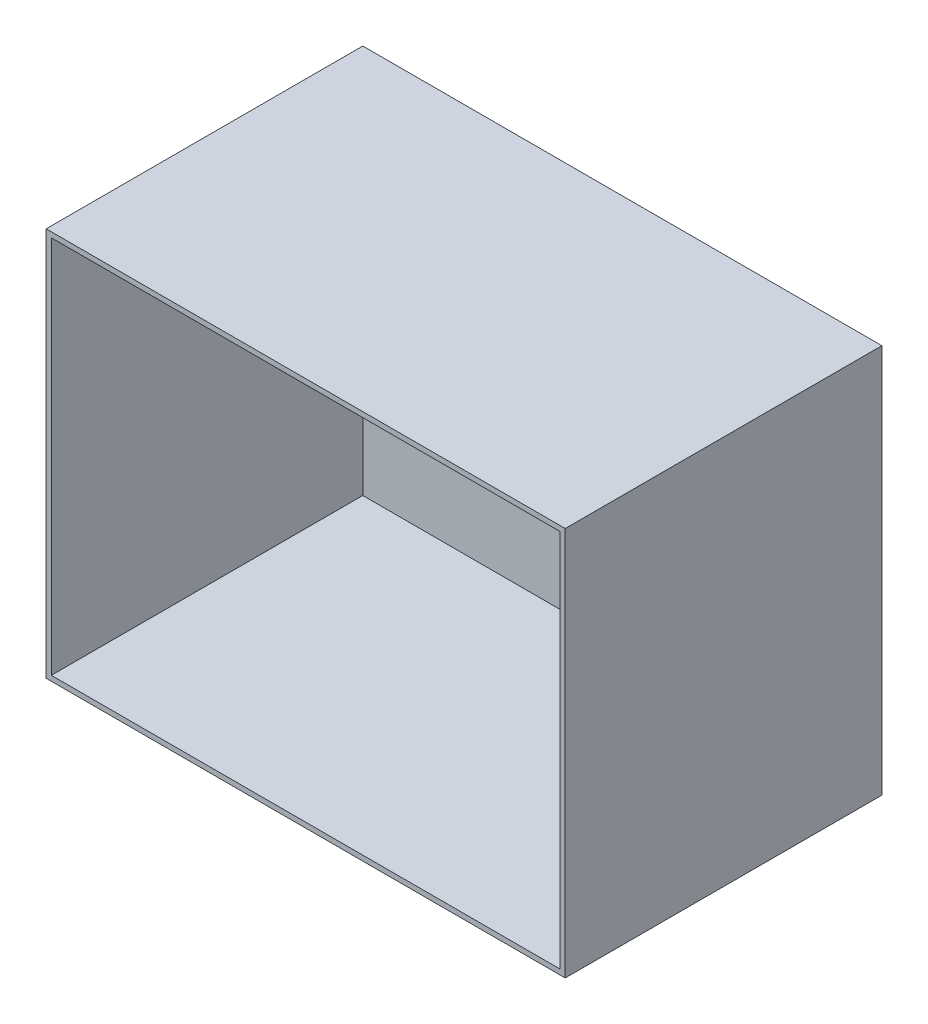
ISO-10303-21;
HEADER;
FILE_DESCRIPTION(('STEP AP214'),'2;1');
FILE_NAME('part.step','',(''),(''),'','','');
FILE_SCHEMA(('AUTOMOTIVE_DESIGN { 1 0 10303 214 1 1 1 1 }'));
ENDSEC;
DATA;
#1=APPLICATION_CONTEXT('core data for automotive mechanical design processes');
#2=APPLICATION_PROTOCOL_DEFINITION('international standard','automotive_design',2000,#1);
#3=PRODUCT_CONTEXT('',#1,'mechanical');
#4=PRODUCT('Part','Part','',(#3));
#5=PRODUCT_RELATED_PRODUCT_CATEGORY('part','',(#4));
#6=PRODUCT_DEFINITION_FORMATION('','',#4);
#7=PRODUCT_DEFINITION_CONTEXT('part definition',#1,'design');
#8=PRODUCT_DEFINITION('design','',#6,#7);
#9=PRODUCT_DEFINITION_SHAPE('','',#8);
#10=(LENGTH_UNIT() NAMED_UNIT(*) SI_UNIT(.MILLI.,.METRE.));
#11=(NAMED_UNIT(*) PLANE_ANGLE_UNIT() SI_UNIT($,.RADIAN.));
#12=(NAMED_UNIT(*) SI_UNIT($,.STERADIAN.) SOLID_ANGLE_UNIT());
#13=UNCERTAINTY_MEASURE_WITH_UNIT(LENGTH_MEASURE(1.E-05),#10,'distance_accuracy_value','');
#14=(GEOMETRIC_REPRESENTATION_CONTEXT(3) GLOBAL_UNCERTAINTY_ASSIGNED_CONTEXT((#13)) GLOBAL_UNIT_ASSIGNED_CONTEXT((#10,
#11,#12)) REPRESENTATION_CONTEXT('',''));
#15=CARTESIAN_POINT('',(0.,0.,0.));
#16=DIRECTION('',(0.,0.,1.));
#17=DIRECTION('',(1.,0.,0.));
#18=AXIS2_PLACEMENT_3D('',#15,#16,#17);
#19=CARTESIAN_POINT('',(0.,0.,1.));
#20=DIRECTION('',(1.,0.,0.));
#21=DIRECTION('',(0.,0.,-1.));
#22=AXIS2_PLACEMENT_3D('',#19,#20,#21);
#23=PLANE('',#22);
#24=DIRECTION('',(0.,-1.,0.));
#25=VECTOR('',#24,1.);
#26=CARTESIAN_POINT('',(0.,0.,0.));
#27=LINE('',#26,#25);
#28=CARTESIAN_POINT('',(0.,75.,0.));
#29=VERTEX_POINT('',#28);
#30=CARTESIAN_POINT('',(0.,0.,0.));
#31=VERTEX_POINT('',#30);
#32=EDGE_CURVE('E107',#29,#31,#27,.T.);
#33=ORIENTED_EDGE('',*,*,#32,.T.);
#34=DIRECTION('',(0.,0.,-1.));
#35=VECTOR('',#34,1.);
#36=CARTESIAN_POINT('',(0.,0.,1.));
#37=LINE('',#36,#35);
#38=CARTESIAN_POINT('',(0.,0.,61.));
#39=VERTEX_POINT('',#38);
#40=EDGE_CURVE('E11',#39,#31,#37,.T.);
#41=ORIENTED_EDGE('',*,*,#40,.F.);
#42=DIRECTION('',(0.,-1.,0.));
#43=VECTOR('',#42,1.);
#44=CARTESIAN_POINT('',(0.,0.,61.));
#45=LINE('',#44,#43);
#46=CARTESIAN_POINT('',(0.,75.,61.));
#47=VERTEX_POINT('',#46);
#48=EDGE_CURVE('E105',#47,#39,#45,.T.);
#49=ORIENTED_EDGE('',*,*,#48,.F.);
#50=DIRECTION('',(0.,0.,-1.));
#51=VECTOR('',#50,1.);
#52=CARTESIAN_POINT('',(0.,75.,1.));
#53=LINE('',#52,#51);
#54=EDGE_CURVE('E182',#47,#29,#53,.T.);
#55=ORIENTED_EDGE('',*,*,#54,.T.);
#56=EDGE_LOOP('',(#33,#41,#49,#55));
#57=FACE_BOUND('',#56,.T.);
#58=ADVANCED_FACE('F39',(#57),#23,.F.);
#59=CARTESIAN_POINT('',(0.,0.,1.));
#60=DIRECTION('',(0.,1.,0.));
#61=DIRECTION('',(0.,0.,1.));
#62=AXIS2_PLACEMENT_3D('',#59,#60,#61);
#63=PLANE('',#62);
#64=DIRECTION('',(1.,0.,0.));
#65=VECTOR('',#64,1.);
#66=CARTESIAN_POINT('',(0.,0.,0.));
#67=LINE('',#66,#65);
#68=CARTESIAN_POINT('',(100.,0.,0.));
#69=VERTEX_POINT('',#68);
#70=EDGE_CURVE('E173',#31,#69,#67,.T.);
#71=ORIENTED_EDGE('',*,*,#70,.T.);
#72=DIRECTION('',(0.,0.,-1.));
#73=VECTOR('',#72,1.);
#74=CARTESIAN_POINT('',(100.,0.,1.));
#75=LINE('',#74,#73);
#76=CARTESIAN_POINT('',(100.,0.,61.));
#77=VERTEX_POINT('',#76);
#78=EDGE_CURVE('E47',#77,#69,#75,.T.);
#79=ORIENTED_EDGE('',*,*,#78,.F.);
#80=DIRECTION('',(1.,0.,0.));
#81=VECTOR('',#80,1.);
#82=CARTESIAN_POINT('',(0.,0.,61.));
#83=LINE('',#82,#81);
#84=EDGE_CURVE('E110',#39,#77,#83,.T.);
#85=ORIENTED_EDGE('',*,*,#84,.F.);
#86=ORIENTED_EDGE('',*,*,#40,.T.);
#87=EDGE_LOOP('',(#71,#79,#85,#86));
#88=FACE_BOUND('',#87,.T.);
#89=ADVANCED_FACE('F111',(#88),#63,.F.);
#90=CARTESIAN_POINT('',(100.,0.,1.));
#91=DIRECTION('',(-1.,0.,0.));
#92=DIRECTION('',(0.,0.,1.));
#93=AXIS2_PLACEMENT_3D('',#90,#91,#92);
#94=PLANE('',#93);
#95=DIRECTION('',(0.,1.,0.));
#96=VECTOR('',#95,1.);
#97=CARTESIAN_POINT('',(100.,0.,0.));
#98=LINE('',#97,#96);
#99=CARTESIAN_POINT('',(100.,75.,0.));
#100=VERTEX_POINT('',#99);
#101=EDGE_CURVE('E176',#69,#100,#98,.T.);
#102=ORIENTED_EDGE('',*,*,#101,.T.);
#103=DIRECTION('',(0.,0.,-1.));
#104=VECTOR('',#103,1.);
#105=CARTESIAN_POINT('',(100.,75.,1.));
#106=LINE('',#105,#104);
#107=CARTESIAN_POINT('',(100.,75.,61.));
#108=VERTEX_POINT('',#107);
#109=EDGE_CURVE('E185',#108,#100,#106,.T.);
#110=ORIENTED_EDGE('',*,*,#109,.F.);
#111=DIRECTION('',(0.,1.,0.));
#112=VECTOR('',#111,1.);
#113=CARTESIAN_POINT('',(100.,0.,61.));
#114=LINE('',#113,#112);
#115=EDGE_CURVE('E117',#77,#108,#114,.T.);
#116=ORIENTED_EDGE('',*,*,#115,.F.);
#117=ORIENTED_EDGE('',*,*,#78,.T.);
#118=EDGE_LOOP('',(#102,#110,#116,#117));
#119=FACE_BOUND('',#118,.T.);
#120=ADVANCED_FACE('F191',(#119),#94,.F.);
#121=CARTESIAN_POINT('',(0.,75.,1.));
#122=DIRECTION('',(0.,-1.,0.));
#123=DIRECTION('',(0.,0.,-1.));
#124=AXIS2_PLACEMENT_3D('',#121,#122,#123);
#125=PLANE('',#124);
#126=DIRECTION('',(-1.,0.,0.));
#127=VECTOR('',#126,1.);
#128=CARTESIAN_POINT('',(0.,75.,0.));
#129=LINE('',#128,#127);
#130=EDGE_CURVE('E179',#100,#29,#129,.T.);
#131=ORIENTED_EDGE('',*,*,#130,.T.);
#132=ORIENTED_EDGE('',*,*,#54,.F.);
#133=DIRECTION('',(-1.,0.,0.));
#134=VECTOR('',#133,1.);
#135=CARTESIAN_POINT('',(0.,75.,61.));
#136=LINE('',#135,#134);
#137=EDGE_CURVE('E123',#108,#47,#136,.T.);
#138=ORIENTED_EDGE('',*,*,#137,.F.);
#139=ORIENTED_EDGE('',*,*,#109,.T.);
#140=EDGE_LOOP('',(#131,#132,#138,#139));
#141=FACE_BOUND('',#140,.T.);
#142=ADVANCED_FACE('F196',(#141),#125,.F.);
#143=CARTESIAN_POINT('',(0.,0.,0.));
#144=DIRECTION('',(0.,0.,-1.));
#145=DIRECTION('',(-1.,0.,0.));
#146=AXIS2_PLACEMENT_3D('',#143,#144,#145);
#147=PLANE('',#146);
#148=ORIENTED_EDGE('',*,*,#32,.F.);
#149=ORIENTED_EDGE('',*,*,#130,.F.);
#150=ORIENTED_EDGE('',*,*,#101,.F.);
#151=ORIENTED_EDGE('',*,*,#70,.F.);
#152=EDGE_LOOP('',(#148,#149,#150,#151));
#153=FACE_BOUND('',#152,.T.);
#154=ADVANCED_FACE('F194',(#153),#147,.T.);
#155=CARTESIAN_POINT('',(99.0000000000001,0.,61.));
#156=DIRECTION('',(1.,0.,0.));
#157=DIRECTION('',(0.,1.,0.));
#158=AXIS2_PLACEMENT_3D('',#155,#156,#157);
#159=PLANE('',#158);
#160=DIRECTION('',(0.,-1.,0.));
#161=VECTOR('',#160,1.);
#162=CARTESIAN_POINT('',(99.0000000000001,0.,1.));
#163=LINE('',#162,#161);
#164=CARTESIAN_POINT('',(99.0000000000001,74.,1.));
#165=VERTEX_POINT('',#164);
#166=CARTESIAN_POINT('',(99.0000000000001,1.,1.));
#167=VERTEX_POINT('',#166);
#168=EDGE_CURVE('E149',#165,#167,#163,.T.);
#169=ORIENTED_EDGE('',*,*,#168,.T.);
#170=DIRECTION('',(0.,0.,-1.));
#171=VECTOR('',#170,1.);
#172=CARTESIAN_POINT('',(99.0000000000001,1.,61.));
#173=LINE('',#172,#171);
#174=CARTESIAN_POINT('',(99.0000000000001,1.,61.));
#175=VERTEX_POINT('',#174);
#176=EDGE_CURVE('E168',#175,#167,#173,.T.);
#177=ORIENTED_EDGE('',*,*,#176,.F.);
#178=DIRECTION('',(0.,-1.,0.));
#179=VECTOR('',#178,1.);
#180=CARTESIAN_POINT('',(99.0000000000001,0.,61.));
#181=LINE('',#180,#179);
#182=CARTESIAN_POINT('',(99.0000000000001,74.,61.));
#183=VERTEX_POINT('',#182);
#184=EDGE_CURVE('E135',#183,#175,#181,.T.);
#185=ORIENTED_EDGE('',*,*,#184,.F.);
#186=DIRECTION('',(0.,0.,-1.));
#187=VECTOR('',#186,1.);
#188=CARTESIAN_POINT('',(99.0000000000001,74.,61.));
#189=LINE('',#188,#187);
#190=EDGE_CURVE('E148',#183,#165,#189,.T.);
#191=ORIENTED_EDGE('',*,*,#190,.T.);
#192=EDGE_LOOP('',(#169,#177,#185,#191));
#193=FACE_BOUND('',#192,.T.);
#194=ADVANCED_FACE('F203',(#193),#159,.F.);
#195=CARTESIAN_POINT('',(0.,0.999999999999988,61.));
#196=DIRECTION('',(0.,-1.,0.));
#197=DIRECTION('',(1.,0.,0.));
#198=AXIS2_PLACEMENT_3D('',#195,#196,#197);
#199=PLANE('',#198);
#200=DIRECTION('',(-1.,0.,0.));
#201=VECTOR('',#200,1.);
#202=CARTESIAN_POINT('',(0.,0.999999999999988,1.));
#203=LINE('',#202,#201);
#204=CARTESIAN_POINT('',(1.,0.999999999999988,1.));
#205=VERTEX_POINT('',#204);
#206=EDGE_CURVE('E54',#167,#205,#203,.T.);
#207=ORIENTED_EDGE('',*,*,#206,.T.);
#208=DIRECTION('',(0.,0.,-1.));
#209=VECTOR('',#208,1.);
#210=CARTESIAN_POINT('',(1.,0.999999999999988,61.));
#211=LINE('',#210,#209);
#212=CARTESIAN_POINT('',(1.,0.999999999999988,61.));
#213=VERTEX_POINT('',#212);
#214=EDGE_CURVE('E164',#213,#205,#211,.T.);
#215=ORIENTED_EDGE('',*,*,#214,.F.);
#216=DIRECTION('',(-1.,0.,0.));
#217=VECTOR('',#216,1.);
#218=CARTESIAN_POINT('',(0.,0.999999999999988,61.));
#219=LINE('',#218,#217);
#220=EDGE_CURVE('E139',#175,#213,#219,.T.);
#221=ORIENTED_EDGE('',*,*,#220,.F.);
#222=ORIENTED_EDGE('',*,*,#176,.T.);
#223=EDGE_LOOP('',(#207,#215,#221,#222));
#224=FACE_BOUND('',#223,.T.);
#225=ADVANCED_FACE('F232',(#224),#199,.F.);
#226=CARTESIAN_POINT('',(1.,0.,61.));
#227=DIRECTION('',(-1.,0.,0.));
#228=DIRECTION('',(0.,0.,1.));
#229=AXIS2_PLACEMENT_3D('',#226,#227,#228);
#230=PLANE('',#229);
#231=DIRECTION('',(0.,1.,0.));
#232=VECTOR('',#231,1.);
#233=CARTESIAN_POINT('',(1.,0.,1.));
#234=LINE('',#233,#232);
#235=CARTESIAN_POINT('',(1.,74.,1.));
#236=VERTEX_POINT('',#235);
#237=EDGE_CURVE('E59',#205,#236,#234,.T.);
#238=ORIENTED_EDGE('',*,*,#237,.T.);
#239=DIRECTION('',(0.,0.,-1.));
#240=VECTOR('',#239,1.);
#241=CARTESIAN_POINT('',(1.,74.,61.));
#242=LINE('',#241,#240);
#243=CARTESIAN_POINT('',(1.,74.,61.));
#244=VERTEX_POINT('',#243);
#245=EDGE_CURVE('E160',#244,#236,#242,.T.);
#246=ORIENTED_EDGE('',*,*,#245,.F.);
#247=DIRECTION('',(0.,1.,0.));
#248=VECTOR('',#247,1.);
#249=CARTESIAN_POINT('',(1.,0.,61.));
#250=LINE('',#249,#248);
#251=EDGE_CURVE('E142',#213,#244,#250,.T.);
#252=ORIENTED_EDGE('',*,*,#251,.F.);
#253=ORIENTED_EDGE('',*,*,#214,.T.);
#254=EDGE_LOOP('',(#238,#246,#252,#253));
#255=FACE_BOUND('',#254,.T.);
#256=ADVANCED_FACE('F243',(#255),#230,.F.);
#257=CARTESIAN_POINT('',(0.,74.,61.));
#258=DIRECTION('',(0.,1.,0.));
#259=DIRECTION('',(0.,0.,1.));
#260=AXIS2_PLACEMENT_3D('',#257,#258,#259);
#261=PLANE('',#260);
#262=DIRECTION('',(1.,0.,0.));
#263=VECTOR('',#262,1.);
#264=CARTESIAN_POINT('',(0.,74.,1.));
#265=LINE('',#264,#263);
#266=EDGE_CURVE('E125',#236,#165,#265,.T.);
#267=ORIENTED_EDGE('',*,*,#266,.T.);
#268=ORIENTED_EDGE('',*,*,#190,.F.);
#269=DIRECTION('',(1.,0.,0.));
#270=VECTOR('',#269,1.);
#271=CARTESIAN_POINT('',(0.,74.,61.));
#272=LINE('',#271,#270);
#273=EDGE_CURVE('E145',#244,#183,#272,.T.);
#274=ORIENTED_EDGE('',*,*,#273,.F.);
#275=ORIENTED_EDGE('',*,*,#245,.T.);
#276=EDGE_LOOP('',(#267,#268,#274,#275));
#277=FACE_BOUND('',#276,.T.);
#278=ADVANCED_FACE('F253',(#277),#261,.F.);
#279=CARTESIAN_POINT('',(0.,0.,61.));
#280=DIRECTION('',(0.,0.,1.));
#281=DIRECTION('',(1.,0.,0.));
#282=AXIS2_PLACEMENT_3D('',#279,#280,#281);
#283=PLANE('',#282);
#284=ORIENTED_EDGE('',*,*,#48,.T.);
#285=ORIENTED_EDGE('',*,*,#84,.T.);
#286=ORIENTED_EDGE('',*,*,#115,.T.);
#287=ORIENTED_EDGE('',*,*,#137,.T.);
#288=EDGE_LOOP('',(#284,#285,#286,#287));
#289=FACE_BOUND('',#288,.T.);
#290=ORIENTED_EDGE('',*,*,#184,.T.);
#291=ORIENTED_EDGE('',*,*,#220,.T.);
#292=ORIENTED_EDGE('',*,*,#251,.T.);
#293=ORIENTED_EDGE('',*,*,#273,.T.);
#294=EDGE_LOOP('',(#290,#291,#292,#293));
#295=FACE_BOUND('',#294,.T.);
#296=ADVANCED_FACE('F120',(#289,#295),#283,.T.);
#297=CARTESIAN_POINT('',(0.,0.,1.));
#298=DIRECTION('',(0.,0.,-1.));
#299=DIRECTION('',(-1.,0.,0.));
#300=AXIS2_PLACEMENT_3D('',#297,#298,#299);
#301=PLANE('',#300);
#302=ORIENTED_EDGE('',*,*,#168,.F.);
#303=ORIENTED_EDGE('',*,*,#266,.F.);
#304=ORIENTED_EDGE('',*,*,#237,.F.);
#305=ORIENTED_EDGE('',*,*,#206,.F.);
#306=EDGE_LOOP('',(#302,#303,#304,#305));
#307=FACE_BOUND('',#306,.T.);
#308=ADVANCED_FACE('F275',(#307),#301,.F.);
#309=CLOSED_SHELL('',(#58,#89,#120,#142,#154,#194,#225,#256,#278,#296,#308));
#310=MANIFOLD_SOLID_BREP('B2',#309);
#311=ADVANCED_BREP_SHAPE_REPRESENTATION('',(#18,#310),#14);
#312=SHAPE_DEFINITION_REPRESENTATION(#9,#311);
ENDSEC;
END-ISO-10303-21;
